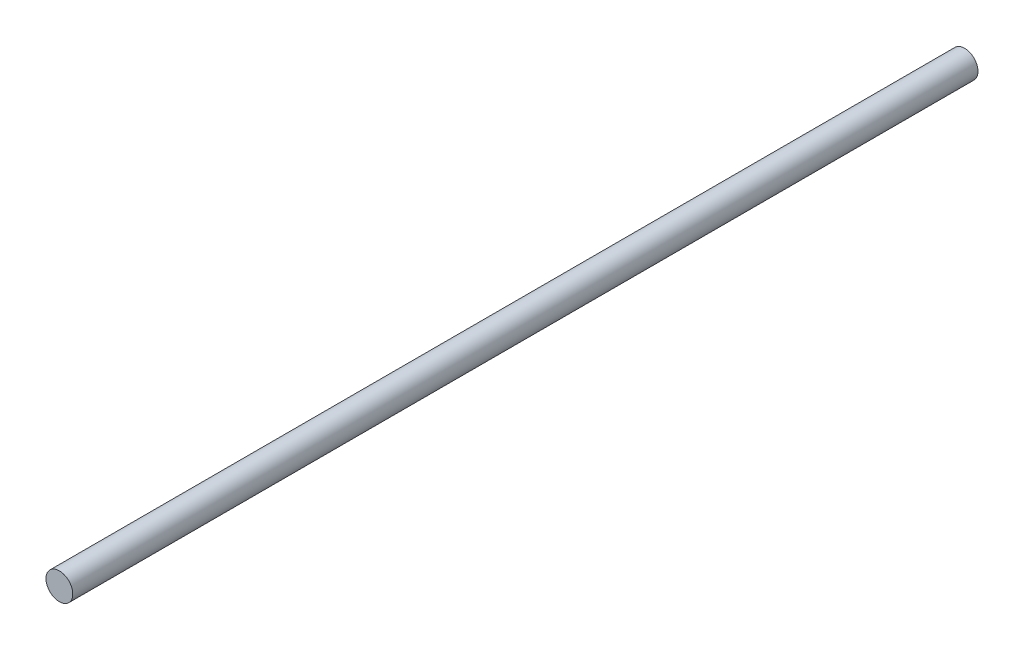
ISO-10303-21;
HEADER;
FILE_DESCRIPTION(('STEP AP214'),'2;1');
FILE_NAME('part.step','',(''),(''),'','','');
FILE_SCHEMA(('AUTOMOTIVE_DESIGN { 1 0 10303 214 1 1 1 1 }'));
ENDSEC;
DATA;
#1=APPLICATION_CONTEXT('core data for automotive mechanical design processes');
#2=APPLICATION_PROTOCOL_DEFINITION('international standard','automotive_design',2000,#1);
#3=PRODUCT_CONTEXT('',#1,'mechanical');
#4=PRODUCT('Part','Part','',(#3));
#5=PRODUCT_RELATED_PRODUCT_CATEGORY('part','',(#4));
#6=PRODUCT_DEFINITION_FORMATION('','',#4);
#7=PRODUCT_DEFINITION_CONTEXT('part definition',#1,'design');
#8=PRODUCT_DEFINITION('design','',#6,#7);
#9=PRODUCT_DEFINITION_SHAPE('','',#8);
#10=(LENGTH_UNIT() NAMED_UNIT(*) SI_UNIT(.MILLI.,.METRE.));
#11=(NAMED_UNIT(*) PLANE_ANGLE_UNIT() SI_UNIT($,.RADIAN.));
#12=(NAMED_UNIT(*) SI_UNIT($,.STERADIAN.) SOLID_ANGLE_UNIT());
#13=UNCERTAINTY_MEASURE_WITH_UNIT(LENGTH_MEASURE(1.E-05),#10,'distance_accuracy_value','');
#14=(GEOMETRIC_REPRESENTATION_CONTEXT(3) GLOBAL_UNCERTAINTY_ASSIGNED_CONTEXT((#13)) GLOBAL_UNIT_ASSIGNED_CONTEXT((#10,
#11,#12)) REPRESENTATION_CONTEXT('',''));
#15=CARTESIAN_POINT('',(0.,0.,0.));
#16=DIRECTION('',(0.,0.,1.));
#17=DIRECTION('',(1.,0.,0.));
#18=AXIS2_PLACEMENT_3D('',#15,#16,#17);
#19=CARTESIAN_POINT('',(0.,0.,338.));
#20=DIRECTION('',(0.,0.,-1.));
#21=DIRECTION('',(-1.,0.,0.));
#22=AXIS2_PLACEMENT_3D('',#19,#20,#21);
#23=CYLINDRICAL_SURFACE('',#22,10.);
#24=CARTESIAN_POINT('',(0.,0.,338.));
#25=DIRECTION('',(0.,0.,1.));
#26=DIRECTION('',(1.,0.,0.));
#27=AXIS2_PLACEMENT_3D('',#24,#25,#26);
#28=CIRCLE('',#27,10.);
#29=CARTESIAN_POINT('',(10.,0.,338.));
#30=VERTEX_POINT('',#29);
#31=EDGE_CURVE('E10',#30,#30,#28,.T.);
#32=ORIENTED_EDGE('',*,*,#31,.F.);
#33=EDGE_LOOP('',(#32));
#34=FACE_BOUND('',#33,.T.);
#35=CARTESIAN_POINT('',(0.,0.,-338.));
#36=DIRECTION('',(0.,0.,1.));
#37=DIRECTION('',(1.,0.,0.));
#38=AXIS2_PLACEMENT_3D('',#35,#36,#37);
#39=CIRCLE('',#38,10.);
#40=CARTESIAN_POINT('',(10.,0.,-338.));
#41=VERTEX_POINT('',#40);
#42=EDGE_CURVE('E37',#41,#41,#39,.T.);
#43=ORIENTED_EDGE('',*,*,#42,.T.);
#44=EDGE_LOOP('',(#43));
#45=FACE_BOUND('',#44,.T.);
#46=ADVANCED_FACE('F34',(#34,#45),#23,.T.);
#47=CARTESIAN_POINT('',(0.,0.,338.));
#48=DIRECTION('',(0.,0.,1.));
#49=DIRECTION('',(1.,0.,0.));
#50=AXIS2_PLACEMENT_3D('',#47,#48,#49);
#51=PLANE('',#50);
#52=ORIENTED_EDGE('',*,*,#31,.T.);
#53=EDGE_LOOP('',(#52));
#54=FACE_BOUND('',#53,.T.);
#55=ADVANCED_FACE('F49',(#54),#51,.T.);
#56=CARTESIAN_POINT('',(0.,0.,-338.));
#57=DIRECTION('',(0.,0.,1.));
#58=DIRECTION('',(1.,0.,0.));
#59=AXIS2_PLACEMENT_3D('',#56,#57,#58);
#60=PLANE('',#59);
#61=ORIENTED_EDGE('',*,*,#42,.F.);
#62=EDGE_LOOP('',(#61));
#63=FACE_BOUND('',#62,.T.);
#64=ADVANCED_FACE('F47',(#63),#60,.F.);
#65=CLOSED_SHELL('',(#46,#55,#64));
#66=MANIFOLD_SOLID_BREP('B2',#65);
#67=ADVANCED_BREP_SHAPE_REPRESENTATION('',(#18,#66),#14);
#68=SHAPE_DEFINITION_REPRESENTATION(#9,#67);
ENDSEC;
END-ISO-10303-21;
